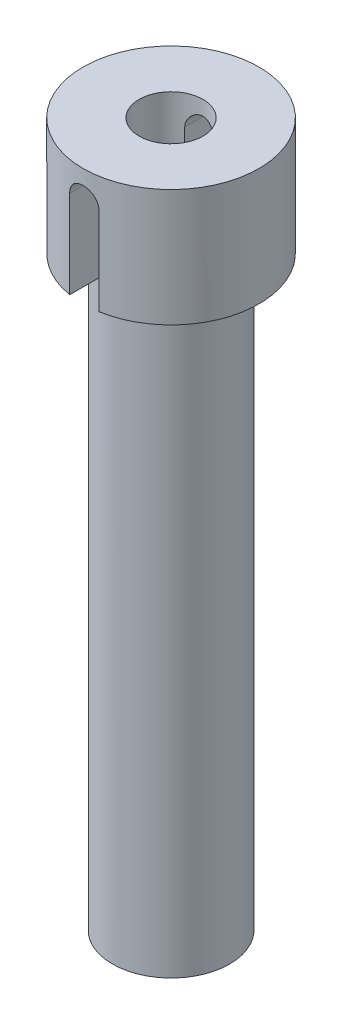
ISO-10303-21;
HEADER;
FILE_DESCRIPTION(('STEP AP214'),'2;1');
FILE_NAME('part.step','',(''),(''),'','','');
FILE_SCHEMA(('AUTOMOTIVE_DESIGN { 1 0 10303 214 1 1 1 1 }'));
ENDSEC;
DATA;
#1=APPLICATION_CONTEXT('core data for automotive mechanical design processes');
#2=APPLICATION_PROTOCOL_DEFINITION('international standard','automotive_design',2000,#1);
#3=PRODUCT_CONTEXT('',#1,'mechanical');
#4=PRODUCT('Part','Part','',(#3));
#5=PRODUCT_RELATED_PRODUCT_CATEGORY('part','',(#4));
#6=PRODUCT_DEFINITION_FORMATION('','',#4);
#7=PRODUCT_DEFINITION_CONTEXT('part definition',#1,'design');
#8=PRODUCT_DEFINITION('design','',#6,#7);
#9=PRODUCT_DEFINITION_SHAPE('','',#8);
#10=(LENGTH_UNIT() NAMED_UNIT(*) SI_UNIT(.MILLI.,.METRE.));
#11=(NAMED_UNIT(*) PLANE_ANGLE_UNIT() SI_UNIT($,.RADIAN.));
#12=(NAMED_UNIT(*) SI_UNIT($,.STERADIAN.) SOLID_ANGLE_UNIT());
#13=UNCERTAINTY_MEASURE_WITH_UNIT(LENGTH_MEASURE(1.E-05),#10,'distance_accuracy_value','');
#14=(GEOMETRIC_REPRESENTATION_CONTEXT(3) GLOBAL_UNCERTAINTY_ASSIGNED_CONTEXT((#13)) GLOBAL_UNIT_ASSIGNED_CONTEXT((#10,
#11,#12)) REPRESENTATION_CONTEXT('',''));
#15=CARTESIAN_POINT('',(0.,0.,0.));
#16=DIRECTION('',(0.,0.,1.));
#17=DIRECTION('',(1.,0.,0.));
#18=AXIS2_PLACEMENT_3D('',#15,#16,#17);
#19=CARTESIAN_POINT('',(0.,31.75,0.));
#20=DIRECTION('',(0.,1.,0.));
#21=DIRECTION('',(0.,0.,1.));
#22=AXIS2_PLACEMENT_3D('',#19,#20,#21);
#23=PLANE('',#22);
#24=CARTESIAN_POINT('',(0.,31.75,0.));
#25=DIRECTION('',(0.,1.,0.));
#26=DIRECTION('',(0.,0.,1.));
#27=AXIS2_PLACEMENT_3D('',#24,#25,#26);
#28=CIRCLE('',#27,4.7625);
#29=CARTESIAN_POINT('',(0.793750000000003,31.75,4.69588832783532));
#30=VERTEX_POINT('',#29);
#31=CARTESIAN_POINT('',(0.793750000000003,31.75,-4.69588832783532));
#32=VERTEX_POINT('',#31);
#33=EDGE_CURVE('E272',#30,#32,#28,.T.);
#34=ORIENTED_EDGE('',*,*,#33,.F.);
#35=DIRECTION('',(0.,0.,1.));
#36=VECTOR('',#35,1.);
#37=CARTESIAN_POINT('',(0.793750000000003,31.75,-4.7625));
#38=LINE('',#37,#36);
#39=CARTESIAN_POINT('',(0.793750000000003,31.75,3.07418053105213));
#40=VERTEX_POINT('',#39);
#41=EDGE_CURVE('E150',#40,#30,#38,.T.);
#42=ORIENTED_EDGE('',*,*,#41,.F.);
#43=CARTESIAN_POINT('',(0.,31.75,0.));
#44=DIRECTION('',(0.,1.,0.));
#45=DIRECTION('',(0.,0.,1.));
#46=AXIS2_PLACEMENT_3D('',#43,#44,#45);
#47=CIRCLE('',#46,3.175);
#48=CARTESIAN_POINT('',(0.793750000000003,31.75,-3.07418053105214));
#49=VERTEX_POINT('',#48);
#50=EDGE_CURVE('E154',#40,#49,#47,.T.);
#51=ORIENTED_EDGE('',*,*,#50,.T.);
#52=EDGE_CURVE('E253',#32,#49,#38,.T.);
#53=ORIENTED_EDGE('',*,*,#52,.F.);
#54=EDGE_LOOP('',(#34,#42,#51,#53));
#55=FACE_BOUND('',#54,.T.);
#56=ADVANCED_FACE('F38',(#55),#23,.F.);
#57=CARTESIAN_POINT('',(0.,31.75,0.));
#58=DIRECTION('',(0.,-1.,0.));
#59=DIRECTION('',(0.,0.,-1.));
#60=AXIS2_PLACEMENT_3D('',#57,#58,#59);
#61=CYLINDRICAL_SURFACE('',#60,3.175);
#62=ORIENTED_EDGE('',*,*,#50,.F.);
#63=CARTESIAN_POINT('',(0.79375,31.75,3.07418053105214));
#64=CARTESIAN_POINT('',(0.793791126432167,31.7060875081703,3.07414310689664));
#65=CARTESIAN_POINT('',(0.790108787395913,31.6622025119373,3.07512046232531));
#66=CARTESIAN_POINT('',(0.775620219149862,31.5757879290246,3.07882075469563));
#67=CARTESIAN_POINT('',(0.764828474578016,31.5332557703956,3.08154014212687));
#68=CARTESIAN_POINT('',(0.736443106169091,31.4506629474007,3.08844232490262));
#69=CARTESIAN_POINT('',(0.718850121521114,31.4106020511926,3.09262498272364));
#70=CARTESIAN_POINT('',(0.677397548848632,31.333985020205,3.1019688250919));
#71=CARTESIAN_POINT('',(0.653536280428175,31.2974298288243,3.1071302719287));
#72=CARTESIAN_POINT('',(0.599666049706842,31.2280749621041,3.11797889110675));
#73=CARTESIAN_POINT('',(0.569545274172009,31.1953634212033,3.12367441490487));
#74=CARTESIAN_POINT('',(0.504250083699317,31.1353976042945,3.13487681754014));
#75=CARTESIAN_POINT('',(0.469074862496363,31.1081442006102,3.14038366610668));
#76=CARTESIAN_POINT('',(0.394062682242309,31.0595081731366,3.15068093282098));
#77=CARTESIAN_POINT('',(0.354167556301449,31.0382127157747,3.15546028964886));
#78=CARTESIAN_POINT('',(0.271226426571567,31.002664734021,3.16366800212568));
#79=CARTESIAN_POINT('',(0.22818104481283,30.9884108235331,3.16709662363373));
#80=CARTESIAN_POINT('',(0.14108438741852,30.9676331766177,3.17215758031262));
#81=CARTESIAN_POINT('',(0.0970711184315754,30.9609587855859,3.17382487589221));
#82=CARTESIAN_POINT('',(0.00851914035556472,30.955056698266,3.17529716558393));
#83=CARTESIAN_POINT('',(-0.0360195019884107,30.9558280660083,3.17510239376739));
#84=CARTESIAN_POINT('',(-0.123311041207992,30.9646875338235,3.17289844652264));
#85=CARTESIAN_POINT('',(-0.166081631982261,30.9726128519656,3.17092963948335));
#86=CARTESIAN_POINT('',(-0.24966510194695,30.9952935140616,3.16544587444538));
#87=CARTESIAN_POINT('',(-0.290477894430435,31.0100491602094,3.16193084803775));
#88=CARTESIAN_POINT('',(-0.369417033275531,31.0461035165431,3.15368779472933));
#89=CARTESIAN_POINT('',(-0.407515718495056,31.0674602441752,3.1489490760049));
#90=CARTESIAN_POINT('',(-0.479644576040554,31.1160661093024,3.13877281774031));
#91=CARTESIAN_POINT('',(-0.513674134228037,31.1433161345127,3.13333517297012));
#92=CARTESIAN_POINT('',(-0.577666953080635,31.2038038864653,3.12218043030613));
#93=CARTESIAN_POINT('',(-0.607495850549086,31.2371832365037,3.11645975066653));
#94=CARTESIAN_POINT('',(-0.661169600304205,31.3085399568737,3.1055164607544));
#95=CARTESIAN_POINT('',(-0.685012814507052,31.3465185816688,3.10029398706629));
#96=CARTESIAN_POINT('',(-0.726126237995697,31.4262655682727,3.09092452034143));
#97=CARTESIAN_POINT('',(-0.743360382948011,31.4680532252613,3.08678346644752));
#98=CARTESIAN_POINT('',(-0.77049499178081,31.554036561932,3.08012352928101));
#99=CARTESIAN_POINT('',(-0.780406418937131,31.5982285350252,3.0776022217314));
#100=CARTESIAN_POINT('',(-0.788911804151056,31.6606692959774,3.0754263697846));
#101=CARTESIAN_POINT('',(-0.790726440329824,31.6784987644255,3.07495990219245));
#102=CARTESIAN_POINT('',(-0.793144176422306,31.7142159957405,3.07433712100624));
#103=CARTESIAN_POINT('',(-0.793749236488736,31.7321036171645,3.07418030561697));
#104=CARTESIAN_POINT('',(-0.79375,31.75,3.07418053105214));
#105=B_SPLINE_CURVE_WITH_KNOTS('',3,(#63,#64,#65,#66,#67,#68,#69,#70,#71,#72,#73,#74,#75,#76,
#77,#78,#79,#80,#81,#82,#83,#84,#85,#86,#87,#88,#89,#90,#91,#92,#93,#94,#95,#96,#97,#98,#99,
#100,#101,#102,#103,#104),.UNSPECIFIED.,.F.,.F.,(4,2,2,2,2,2,2,2,2,2,2,2,2,2,2,2,2,2,2,2,4),(0.,
0.131530270967041,0.262793388707346,0.394044173172473,0.525330179201699,0.659201611595798,
0.79309442238408,0.928854340604584,1.06458752445096,1.19757280254024,1.33054136392442,
1.4605585602541,1.59058150947681,1.72178139927471,1.8530010656667,1.98775845244277,
2.12255267776127,2.25807232179081,2.39338865786098,2.44713665474836,2.50079748063248),.UNSPECIFIED.);
#106=CARTESIAN_POINT('',(-0.79375,31.75,3.07418053105213));
#107=VERTEX_POINT('',#106);
#108=EDGE_CURVE('E134',#40,#107,#105,.T.);
#109=ORIENTED_EDGE('',*,*,#108,.T.);
#110=CARTESIAN_POINT('',(-0.79375,31.75,-3.07418053105214));
#111=VERTEX_POINT('',#110);
#112=EDGE_CURVE('E147',#111,#107,#47,.T.);
#113=ORIENTED_EDGE('',*,*,#112,.F.);
#114=CARTESIAN_POINT('',(-0.79375,31.75,-3.07418053105214));
#115=CARTESIAN_POINT('',(-0.793791126432167,31.7060875081703,-3.07414310689664));
#116=CARTESIAN_POINT('',(-0.790108787395913,31.6622025119373,-3.07512046232531));
#117=CARTESIAN_POINT('',(-0.775620219149862,31.5757879290246,-3.07882075469563));
#118=CARTESIAN_POINT('',(-0.764828474578016,31.5332557703956,-3.08154014212687));
#119=CARTESIAN_POINT('',(-0.736443106169091,31.4506629474007,-3.08844232490262));
#120=CARTESIAN_POINT('',(-0.718850121521114,31.4106020511926,-3.09262498272364));
#121=CARTESIAN_POINT('',(-0.677397548848632,31.333985020205,-3.1019688250919));
#122=CARTESIAN_POINT('',(-0.653536280428175,31.2974298288243,-3.1071302719287));
#123=CARTESIAN_POINT('',(-0.599666049706842,31.2280749621041,-3.11797889110675));
#124=CARTESIAN_POINT('',(-0.569545274172009,31.1953634212033,-3.12367441490487));
#125=CARTESIAN_POINT('',(-0.504250083699317,31.1353976042945,-3.13487681754014));
#126=CARTESIAN_POINT('',(-0.469074862496363,31.1081442006102,-3.14038366610668));
#127=CARTESIAN_POINT('',(-0.394062682242309,31.0595081731366,-3.15068093282098));
#128=CARTESIAN_POINT('',(-0.354167556301449,31.0382127157747,-3.15546028964886));
#129=CARTESIAN_POINT('',(-0.271226426571567,31.002664734021,-3.16366800212568));
#130=CARTESIAN_POINT('',(-0.22818104481283,30.9884108235331,-3.16709662363373));
#131=CARTESIAN_POINT('',(-0.14108438741852,30.9676331766177,-3.17215758031262));
#132=CARTESIAN_POINT('',(-0.0970711184315752,30.9609587855859,-3.17382487589221));
#133=CARTESIAN_POINT('',(-0.00851914035556457,30.955056698266,-3.17529716558393));
#134=CARTESIAN_POINT('',(0.0360195019884109,30.9558280660083,-3.17510239376739));
#135=CARTESIAN_POINT('',(0.123311041207992,30.9646875338235,-3.17289844652264));
#136=CARTESIAN_POINT('',(0.166081631982261,30.9726128519656,-3.17092963948335));
#137=CARTESIAN_POINT('',(0.24966510194695,30.9952935140616,-3.16544587444538));
#138=CARTESIAN_POINT('',(0.290477894430435,31.0100491602094,-3.16193084803775));
#139=CARTESIAN_POINT('',(0.369417033275531,31.0461035165431,-3.15368779472933));
#140=CARTESIAN_POINT('',(0.407515718495056,31.0674602441752,-3.1489490760049));
#141=CARTESIAN_POINT('',(0.479644576040554,31.1160661093024,-3.13877281774031));
#142=CARTESIAN_POINT('',(0.513674134228037,31.1433161345127,-3.13333517297012));
#143=CARTESIAN_POINT('',(0.577666953080634,31.2038038864653,-3.12218043030613));
#144=CARTESIAN_POINT('',(0.607495850549086,31.2371832365037,-3.11645975066653));
#145=CARTESIAN_POINT('',(0.661169600304205,31.3085399568737,-3.1055164607544));
#146=CARTESIAN_POINT('',(0.685012814507052,31.3465185816688,-3.10029398706629));
#147=CARTESIAN_POINT('',(0.726126237995697,31.4262655682727,-3.09092452034143));
#148=CARTESIAN_POINT('',(0.743360382948011,31.4680532252613,-3.08678346644752));
#149=CARTESIAN_POINT('',(0.77049499178081,31.554036561932,-3.08012352928101));
#150=CARTESIAN_POINT('',(0.780406418937131,31.5982285350252,-3.0776022217314));
#151=CARTESIAN_POINT('',(0.788911804151056,31.6606692959774,-3.0754263697846));
#152=CARTESIAN_POINT('',(0.790726440329824,31.6784987644255,-3.07495990219245));
#153=CARTESIAN_POINT('',(0.793144176422306,31.7142159957405,-3.07433712100624));
#154=CARTESIAN_POINT('',(0.793749236488736,31.7321036171645,-3.07418030561697));
#155=CARTESIAN_POINT('',(0.79375,31.75,-3.07418053105214));
#156=B_SPLINE_CURVE_WITH_KNOTS('',3,(#114,#115,#116,#117,#118,#119,#120,#121,#122,#123,#124,
#125,#126,#127,#128,#129,#130,#131,#132,#133,#134,#135,#136,#137,#138,#139,#140,#141,#142,#143,
#144,#145,#146,#147,#148,#149,#150,#151,#152,#153,#154,#155),.UNSPECIFIED.,.F.,.F.,(4,2,2,2,2,2,
2,2,2,2,2,2,2,2,2,2,2,2,2,2,4),(0.,0.131530270967041,0.262793388707346,0.394044173172473,
0.525330179201699,0.659201611595799,0.79309442238408,0.928854340604584,1.06458752445096,
1.19757280254024,1.33054136392442,1.4605585602541,1.59058150947681,1.72178139927471,
1.8530010656667,1.98775845244277,2.12255267776127,2.25807232179082,2.39338865786098,
2.44713665474836,2.50079748063248),.UNSPECIFIED.);
#157=EDGE_CURVE('E123',#111,#49,#156,.T.);
#158=ORIENTED_EDGE('',*,*,#157,.T.);
#159=EDGE_LOOP('',(#62,#109,#113,#158));
#160=FACE_BOUND('',#159,.T.);
#161=CARTESIAN_POINT('',(0.,0.,0.));
#162=DIRECTION('',(0.,1.,0.));
#163=DIRECTION('',(0.,0.,1.));
#164=AXIS2_PLACEMENT_3D('',#161,#162,#163);
#165=CIRCLE('',#164,3.175);
#166=CARTESIAN_POINT('',(0.,0.,3.175));
#167=VERTEX_POINT('',#166);
#168=EDGE_CURVE('E155',#167,#167,#165,.T.);
#169=ORIENTED_EDGE('',*,*,#168,.T.);
#170=EDGE_LOOP('',(#169));
#171=FACE_BOUND('',#170,.T.);
#172=ADVANCED_FACE('F40',(#160,#171),#61,.T.);
#173=CARTESIAN_POINT('',(0.,0.,0.));
#174=DIRECTION('',(0.,1.,0.));
#175=DIRECTION('',(0.,0.,1.));
#176=AXIS2_PLACEMENT_3D('',#173,#174,#175);
#177=PLANE('',#176);
#178=CARTESIAN_POINT('',(0.,0.,0.));
#179=DIRECTION('',(0.,1.,0.));
#180=DIRECTION('',(0.,0.,1.));
#181=AXIS2_PLACEMENT_3D('',#178,#179,#180);
#182=CIRCLE('',#181,1.72719999999999);
#183=CARTESIAN_POINT('',(0.,0.,1.72719999999999));
#184=VERTEX_POINT('',#183);
#185=EDGE_CURVE('E274',#184,#184,#182,.T.);
#186=ORIENTED_EDGE('',*,*,#185,.T.);
#187=EDGE_LOOP('',(#186));
#188=FACE_BOUND('',#187,.T.);
#189=ORIENTED_EDGE('',*,*,#168,.F.);
#190=EDGE_LOOP('',(#189));
#191=FACE_BOUND('',#190,.T.);
#192=ADVANCED_FACE('F293',(#188,#191),#177,.F.);
#193=CARTESIAN_POINT('',(-0.793750000000001,31.75,-4.69588832783532));
#194=VERTEX_POINT('',#193);
#195=CARTESIAN_POINT('',(-0.79375,31.75,4.69588832783532));
#196=VERTEX_POINT('',#195);
#197=EDGE_CURVE('E149',#194,#196,#28,.T.);
#198=ORIENTED_EDGE('',*,*,#197,.F.);
#199=DIRECTION('',(0.,0.,1.));
#200=VECTOR('',#199,1.);
#201=CARTESIAN_POINT('',(-0.79375,31.75,-4.7625));
#202=LINE('',#201,#200);
#203=EDGE_CURVE('E67',#194,#111,#202,.T.);
#204=ORIENTED_EDGE('',*,*,#203,.T.);
#205=ORIENTED_EDGE('',*,*,#112,.T.);
#206=EDGE_CURVE('E151',#107,#196,#202,.T.);
#207=ORIENTED_EDGE('',*,*,#206,.T.);
#208=EDGE_LOOP('',(#198,#204,#205,#207));
#209=FACE_BOUND('',#208,.T.);
#210=ADVANCED_FACE('F145',(#209),#23,.F.);
#211=CARTESIAN_POINT('',(0.,38.1,0.));
#212=DIRECTION('',(0.,-1.,0.));
#213=DIRECTION('',(0.,0.,-1.));
#214=AXIS2_PLACEMENT_3D('',#211,#212,#213);
#215=CYLINDRICAL_SURFACE('',#214,4.7625);
#216=CARTESIAN_POINT('',(0.,38.1,0.));
#217=DIRECTION('',(0.,1.,0.));
#218=DIRECTION('',(0.,0.,1.));
#219=AXIS2_PLACEMENT_3D('',#216,#217,#218);
#220=CIRCLE('',#219,4.7625);
#221=CARTESIAN_POINT('',(0.,38.1,4.7625));
#222=VERTEX_POINT('',#221);
#223=EDGE_CURVE('E158',#222,#222,#220,.T.);
#224=ORIENTED_EDGE('',*,*,#223,.F.);
#225=EDGE_LOOP('',(#224));
#226=FACE_BOUND('',#225,.T.);
#227=DIRECTION('',(0.,-1.,0.));
#228=VECTOR('',#227,1.);
#229=CARTESIAN_POINT('',(0.793749999999998,38.1,-4.69588832783532));
#230=LINE('',#229,#228);
#231=CARTESIAN_POINT('',(0.79375,36.5125,-4.69588832783532));
#232=VERTEX_POINT('',#231);
#233=EDGE_CURVE('E202',#32,#232,#230,.F.);
#234=ORIENTED_EDGE('',*,*,#233,.T.);
#235=CARTESIAN_POINT('',(0.79375,36.5125,-4.69588832783532));
#236=CARTESIAN_POINT('',(0.793789378101121,36.556826037943,-4.69586379445431));
#237=CARTESIAN_POINT('',(0.790039520432826,36.6011336790469,-4.69651527828899));
#238=CARTESIAN_POINT('',(0.775260388672243,36.6884272643288,-4.69898689448322));
#239=CARTESIAN_POINT('',(0.764240668633823,36.7314148658091,-4.7008054929354));
#240=CARTESIAN_POINT('',(0.735216253025076,36.8149153484446,-4.70542935071898));
#241=CARTESIAN_POINT('',(0.717210023184568,36.8554276837562,-4.70823482676067));
#242=CARTESIAN_POINT('',(0.674748996518666,36.9328588531935,-4.71450761492235));
#243=CARTESIAN_POINT('',(0.650294115788974,36.9697776405545,-4.71797493565354));
#244=CARTESIAN_POINT('',(0.595373550894959,37.0393303140357,-4.72522034281928));
#245=CARTESIAN_POINT('',(0.564857357203615,37.0719240684342,-4.72900087345656));
#246=CARTESIAN_POINT('',(0.498786903668918,37.131556791129,-4.73642494294252));
#247=CARTESIAN_POINT('',(0.463231872889268,37.1585949078655,-4.74006846072026));
#248=CARTESIAN_POINT('',(0.387832446884617,37.2064968207141,-4.74683380221988));
#249=CARTESIAN_POINT('',(0.34796378420732,37.2273229148897,-4.74995239221908));
#250=CARTESIAN_POINT('',(0.265235661562713,37.2619662265721,-4.75528886936153));
#251=CARTESIAN_POINT('',(0.222376566694255,37.2757842979841,-4.75750686623259));
#252=CARTESIAN_POINT('',(0.135301151183474,37.2958970109311,-4.76077511259901));
#253=CARTESIAN_POINT('',(0.0911009746503003,37.3022598001853,-4.76183593340943));
#254=CARTESIAN_POINT('',(0.00224746549831503,37.3074932779765,-4.7627066313961));
#255=CARTESIAN_POINT('',(-0.0424058469799614,37.3063642980565,-4.76251656392952));
#256=CARTESIAN_POINT('',(-0.130429834438074,37.2966991564408,-4.76091522294728));
#257=CARTESIAN_POINT('',(-0.17380883630316,37.2882365344299,-4.75951607414722));
#258=CARTESIAN_POINT('',(-0.258522092796689,37.2642601816887,-4.75566731704393));
#259=CARTESIAN_POINT('',(-0.299856298160218,37.2487462811649,-4.7532176834453));
#260=CARTESIAN_POINT('',(-0.379526319465393,37.2110343819102,-4.74752251447483));
#261=CARTESIAN_POINT('',(-0.417847467282033,37.1888059628555,-4.74427336958264));
#262=CARTESIAN_POINT('',(-0.490242081389746,37.138319077843,-4.73734033130495));
#263=CARTESIAN_POINT('',(-0.524315361707614,37.1100603480227,-4.7336564188989));
#264=CARTESIAN_POINT('',(-0.587678975066217,37.0479114636045,-4.72621111659405));
#265=CARTESIAN_POINT('',(-0.616906941930364,37.0139577443459,-4.72244932757467));
#266=CARTESIAN_POINT('',(-0.669269207196587,36.9415835837212,-4.71531396225441));
#267=CARTESIAN_POINT('',(-0.692401768215521,36.9031618733248,-4.71194049679197));
#268=CARTESIAN_POINT('',(-0.731928989426751,36.8228646260976,-4.70596303316436));
#269=CARTESIAN_POINT('',(-0.748312200087149,36.7809833637868,-4.70336034462266));
#270=CARTESIAN_POINT('',(-0.773770309296436,36.6950389199281,-4.69923982017744));
#271=CARTESIAN_POINT('',(-0.782856134440365,36.6509791058062,-4.69772036270425));
#272=CARTESIAN_POINT('',(-0.790025680696496,36.5909035145426,-4.69651652199119));
#273=CARTESIAN_POINT('',(-0.791422883116209,36.5752424512317,-4.69628115967762));
#274=CARTESIAN_POINT('',(-0.793283827342451,36.5438898753368,-4.69596722105045));
#275=CARTESIAN_POINT('',(-0.793749138987004,36.5281984586079,-4.69588838106552));
#276=CARTESIAN_POINT('',(-0.793750000000001,36.5125,-4.69588832783533));
#277=B_SPLINE_CURVE_WITH_KNOTS('',3,(#235,#236,#237,#238,#239,#240,#241,#242,#243,#244,#245,
#246,#247,#248,#249,#250,#251,#252,#253,#254,#255,#256,#257,#258,#259,#260,#261,#262,#263,#264,
#265,#266,#267,#268,#269,#270,#271,#272,#273,#274,#275,#276),.UNSPECIFIED.,.F.,.F.,(4,2,2,2,2,2,
2,2,2,2,2,2,2,2,2,2,2,2,2,2,4),(0.,0.132787398390374,0.265400634278613,0.398043009150665,
0.530687109936322,0.664486794421511,0.798306972249968,0.932923534883666,1.06752369097829,
1.20088364197594,1.33423769126144,1.46626977762679,1.59830504346964,1.73094770677991,
1.8635961751971,1.99783794700485,2.13211794066765,2.26662479680671,2.40092987433434,
2.44808360261026,2.49515782994848),.UNSPECIFIED.);
#278=CARTESIAN_POINT('',(-0.79375,36.5125,-4.69588832783532));
#279=VERTEX_POINT('',#278);
#280=EDGE_CURVE('E208',#232,#279,#277,.T.);
#281=ORIENTED_EDGE('',*,*,#280,.T.);
#282=DIRECTION('',(0.,-1.,0.));
#283=VECTOR('',#282,1.);
#284=CARTESIAN_POINT('',(-0.793750000000001,38.1,-4.69588832783532));
#285=LINE('',#284,#283);
#286=EDGE_CURVE('E135',#279,#194,#285,.T.);
#287=ORIENTED_EDGE('',*,*,#286,.T.);
#288=ORIENTED_EDGE('',*,*,#197,.T.);
#289=DIRECTION('',(0.,-1.,0.));
#290=VECTOR('',#289,1.);
#291=CARTESIAN_POINT('',(-0.793750000000001,38.1,4.69588832783532));
#292=LINE('',#291,#290);
#293=CARTESIAN_POINT('',(-0.793750000000001,36.5125,4.69588832783532));
#294=VERTEX_POINT('',#293);
#295=EDGE_CURVE('E257',#196,#294,#292,.F.);
#296=ORIENTED_EDGE('',*,*,#295,.T.);
#297=CARTESIAN_POINT('',(-0.79375,36.5125,4.69588832783532));
#298=CARTESIAN_POINT('',(-0.793789378101121,36.556826037943,4.69586379445431));
#299=CARTESIAN_POINT('',(-0.790039520432826,36.6011336790469,4.69651527828899));
#300=CARTESIAN_POINT('',(-0.775260388672243,36.6884272643288,4.69898689448322));
#301=CARTESIAN_POINT('',(-0.764240668633824,36.7314148658091,4.7008054929354));
#302=CARTESIAN_POINT('',(-0.735216253025076,36.8149153484446,4.70542935071898));
#303=CARTESIAN_POINT('',(-0.71721002318457,36.8554276837562,4.70823482676067));
#304=CARTESIAN_POINT('',(-0.674748996518668,36.9328588531935,4.71450761492235));
#305=CARTESIAN_POINT('',(-0.650294115788975,36.9697776405545,4.71797493565354));
#306=CARTESIAN_POINT('',(-0.595373550894959,37.0393303140357,4.72522034281928));
#307=CARTESIAN_POINT('',(-0.564857357203615,37.0719240684342,4.72900087345656));
#308=CARTESIAN_POINT('',(-0.498786903668918,37.131556791129,4.73642494294252));
#309=CARTESIAN_POINT('',(-0.463231872889268,37.1585949078655,4.74006846072026));
#310=CARTESIAN_POINT('',(-0.387832446884617,37.2064968207141,4.74683380221988));
#311=CARTESIAN_POINT('',(-0.34796378420732,37.2273229148897,4.74995239221908));
#312=CARTESIAN_POINT('',(-0.265235661562713,37.2619662265721,4.75528886936153));
#313=CARTESIAN_POINT('',(-0.222376566694255,37.2757842979841,4.75750686623259));
#314=CARTESIAN_POINT('',(-0.135301151183475,37.2958970109311,4.76077511259901));
#315=CARTESIAN_POINT('',(-0.0911009746503005,37.3022598001853,4.76183593340943));
#316=CARTESIAN_POINT('',(-0.00224746549831515,37.3074932779765,4.7627066313961));
#317=CARTESIAN_POINT('',(0.0424058469799613,37.3063642980565,4.76251656392952));
#318=CARTESIAN_POINT('',(0.130429834438074,37.2966991564408,4.76091522294728));
#319=CARTESIAN_POINT('',(0.17380883630316,37.2882365344299,4.75951607414722));
#320=CARTESIAN_POINT('',(0.258522092796689,37.2642601816887,4.75566731704393));
#321=CARTESIAN_POINT('',(0.299856298160218,37.2487462811649,4.7532176834453));
#322=CARTESIAN_POINT('',(0.379526319465393,37.2110343819102,4.74752251447483));
#323=CARTESIAN_POINT('',(0.417847467282033,37.1888059628555,4.74427336958264));
#324=CARTESIAN_POINT('',(0.490242081389746,37.138319077843,4.73734033130495));
#325=CARTESIAN_POINT('',(0.524315361707615,37.1100603480227,4.7336564188989));
#326=CARTESIAN_POINT('',(0.587678975066217,37.0479114636045,4.72621111659405));
#327=CARTESIAN_POINT('',(0.616906941930364,37.0139577443459,4.72244932757467));
#328=CARTESIAN_POINT('',(0.669269207196587,36.9415835837212,4.71531396225441));
#329=CARTESIAN_POINT('',(0.692401768215521,36.9031618733248,4.71194049679197));
#330=CARTESIAN_POINT('',(0.731928989426751,36.8228646260976,4.70596303316436));
#331=CARTESIAN_POINT('',(0.748312200087149,36.7809833637868,4.70336034462266));
#332=CARTESIAN_POINT('',(0.773770309296436,36.6950389199281,4.69923982017744));
#333=CARTESIAN_POINT('',(0.782856134440365,36.6509791058062,4.69772036270425));
#334=CARTESIAN_POINT('',(0.790025680696496,36.5909035145426,4.69651652199119));
#335=CARTESIAN_POINT('',(0.791422883116209,36.5752424512317,4.69628115967762));
#336=CARTESIAN_POINT('',(0.793283827342451,36.5438898753368,4.69596722105045));
#337=CARTESIAN_POINT('',(0.793749138987004,36.5281984586079,4.69588838106552));
#338=CARTESIAN_POINT('',(0.793750000000001,36.5125,4.69588832783533));
#339=B_SPLINE_CURVE_WITH_KNOTS('',3,(#297,#298,#299,#300,#301,#302,#303,#304,#305,#306,#307,
#308,#309,#310,#311,#312,#313,#314,#315,#316,#317,#318,#319,#320,#321,#322,#323,#324,#325,#326,
#327,#328,#329,#330,#331,#332,#333,#334,#335,#336,#337,#338),.UNSPECIFIED.,.F.,.F.,(4,2,2,2,2,2,
2,2,2,2,2,2,2,2,2,2,2,2,2,2,4),(0.,0.132787398390374,0.265400634278613,0.398043009150658,
0.530687109936322,0.664486794421511,0.798306972249968,0.932923534883666,1.06752369097829,
1.20088364197594,1.33423769126144,1.46626977762679,1.59830504346964,1.73094770677991,
1.8635961751971,1.99783794700485,2.13211794066764,2.26662479680671,2.40092987433434,
2.44808360261026,2.49515782994848),.UNSPECIFIED.);
#340=CARTESIAN_POINT('',(0.79375,36.5125,4.69588832783532));
#341=VERTEX_POINT('',#340);
#342=EDGE_CURVE('E214',#294,#341,#339,.T.);
#343=ORIENTED_EDGE('',*,*,#342,.T.);
#344=DIRECTION('',(0.,-1.,0.));
#345=VECTOR('',#344,1.);
#346=CARTESIAN_POINT('',(0.793749999999998,38.1,4.69588832783532));
#347=LINE('',#346,#345);
#348=EDGE_CURVE('E205',#341,#30,#347,.T.);
#349=ORIENTED_EDGE('',*,*,#348,.T.);
#350=ORIENTED_EDGE('',*,*,#33,.T.);
#351=EDGE_LOOP('',(#234,#281,#287,#288,#296,#343,#349,#350));
#352=FACE_BOUND('',#351,.T.);
#353=ADVANCED_FACE('F219',(#226,#352),#215,.T.);
#354=CARTESIAN_POINT('',(0.,38.1,0.));
#355=DIRECTION('',(0.,1.,0.));
#356=DIRECTION('',(0.,0.,1.));
#357=AXIS2_PLACEMENT_3D('',#354,#355,#356);
#358=PLANE('',#357);
#359=CARTESIAN_POINT('',(0.,38.1,0.));
#360=DIRECTION('',(0.,1.,0.));
#361=DIRECTION('',(0.,0.,1.));
#362=AXIS2_PLACEMENT_3D('',#359,#360,#361);
#363=CIRCLE('',#362,1.72719999999999);
#364=CARTESIAN_POINT('',(0.,38.1,1.72719999999999));
#365=VERTEX_POINT('',#364);
#366=EDGE_CURVE('E276',#365,#365,#363,.T.);
#367=ORIENTED_EDGE('',*,*,#366,.F.);
#368=EDGE_LOOP('',(#367));
#369=FACE_BOUND('',#368,.T.);
#370=ORIENTED_EDGE('',*,*,#223,.T.);
#371=EDGE_LOOP('',(#370));
#372=FACE_BOUND('',#371,.T.);
#373=ADVANCED_FACE('F284',(#369,#372),#358,.T.);
#374=CARTESIAN_POINT('',(0.,38.1,0.));
#375=DIRECTION('',(0.,1.,0.));
#376=DIRECTION('',(0.,0.,1.));
#377=AXIS2_PLACEMENT_3D('',#374,#375,#376);
#378=CYLINDRICAL_SURFACE('',#377,1.72719999999999);
#379=DIRECTION('',(0.,1.,0.));
#380=VECTOR('',#379,1.);
#381=CARTESIAN_POINT('',(0.793749999999998,38.1,1.53400807608695));
#382=LINE('',#381,#380);
#383=CARTESIAN_POINT('',(0.793750000000003,31.75,1.53400807608694));
#384=VERTEX_POINT('',#383);
#385=CARTESIAN_POINT('',(0.79375,36.5125,1.53400807608694));
#386=VERTEX_POINT('',#385);
#387=EDGE_CURVE('E52',#384,#386,#382,.T.);
#388=ORIENTED_EDGE('',*,*,#387,.T.);
#389=CARTESIAN_POINT('',(0.79375,36.5125,1.53400807608694));
#390=CARTESIAN_POINT('',(0.793751275656469,36.5335394366391,1.53400454042616));
#391=CARTESIAN_POINT('',(0.792912938837507,36.554567315188,1.53444145999201));
#392=CARTESIAN_POINT('',(0.789577801219466,36.5964458104127,1.53616148082301));
#393=CARTESIAN_POINT('',(0.787081843528467,36.6172965117477,1.53744415191506));
#394=CARTESIAN_POINT('',(0.777175896861143,36.6791433977735,1.5424898133022));
#395=CARTESIAN_POINT('',(0.767347266160624,36.7196821687943,1.54745126684986));
#396=CARTESIAN_POINT('',(0.741676035775504,36.7982731178537,1.55991547136942));
#397=CARTESIAN_POINT('',(0.725842981319754,36.8363291307731,1.56741418682886));
#398=CARTESIAN_POINT('',(0.688672526049634,36.9092970776987,1.58409739296676));
#399=CARTESIAN_POINT('',(0.667328003830584,36.9442048645323,1.5932840601964));
#400=CARTESIAN_POINT('',(0.61803268672526,37.012466729779,1.61307370999576));
#401=CARTESIAN_POINT('',(0.58972959638895,37.0455507214083,1.62373060057895));
#402=CARTESIAN_POINT('',(0.528060727059651,37.1067030402723,1.64482017277706));
#403=CARTESIAN_POINT('',(0.49469373149311,37.1347701586945,1.65525279982454));
#404=CARTESIAN_POINT('',(0.421596465384426,37.1865994255987,1.67540711765938));
#405=CARTESIAN_POINT('',(0.38161742468797,37.2100406508386,1.6850583375683));
#406=CARTESIAN_POINT('',(0.297757869142571,37.2497434665232,1.70187664493476));
#407=CARTESIAN_POINT('',(0.253879457185036,37.2660088989084,1.70904506124966));
#408=CARTESIAN_POINT('',(0.166337649903327,37.289867380336,1.71970176727884));
#409=CARTESIAN_POINT('',(0.122828070549754,37.2979336488211,1.72338985412364));
#410=CARTESIAN_POINT('',(0.034927043960315,37.3067085815988,1.72740609569215));
#411=CARTESIAN_POINT('',(-0.00946396666181533,37.3074208018789,1.72773587429621));
#412=CARTESIAN_POINT('',(-0.0943698547927264,37.3016830712387,1.72510468336714));
#413=CARTESIAN_POINT('',(-0.134929167674622,37.2957574142658,1.72238459335843));
#414=CARTESIAN_POINT('',(-0.214401489040043,37.2778304399893,1.71430675915793));
#415=CARTESIAN_POINT('',(-0.253314406371142,37.2658287867648,1.70894886913173));
#416=CARTESIAN_POINT('',(-0.329108062096195,37.23597205187,1.6959980913551));
#417=CARTESIAN_POINT('',(-0.365949389143355,37.2180315719098,1.68837277193251));
#418=CARTESIAN_POINT('',(-0.43619500536756,37.1769029599206,1.67160397385226));
#419=CARTESIAN_POINT('',(-0.469597973688887,37.1537128220833,1.6624599152658));
#420=CARTESIAN_POINT('',(-0.53496779354023,37.1005207308996,1.64264740194782));
#421=CARTESIAN_POINT('',(-0.566585889399607,37.0701133894957,1.63191541632935));
#422=CARTESIAN_POINT('',(-0.624448309087947,37.0044549931421,1.61066332776191));
#423=CARTESIAN_POINT('',(-0.65068897669369,36.9692006696651,1.60014337333044));
#424=CARTESIAN_POINT('',(-0.698246477382904,36.8927782763336,1.57999090934957));
#425=CARTESIAN_POINT('',(-0.719269382368154,36.8514085560463,1.57042450294329));
#426=CARTESIAN_POINT('',(-0.753878510381868,36.7651922985746,1.55410980260937));
#427=CARTESIAN_POINT('',(-0.767480240136925,36.7203532364058,1.54735563948469));
#428=CARTESIAN_POINT('',(-0.782573571307504,36.6479773194578,1.53975201729347));
#429=CARTESIAN_POINT('',(-0.786752978222178,36.6211106309574,1.53761371799712));
#430=CARTESIAN_POINT('',(-0.792344887630314,36.5670033852394,1.53473542933206));
#431=CARTESIAN_POINT('',(-0.793755899167416,36.5397626345134,1.53399619345524));
#432=CARTESIAN_POINT('',(-0.79375,36.5125,1.53400807608694));
#433=B_SPLINE_CURVE_WITH_KNOTS('',3,(#389,#390,#391,#392,#393,#394,#395,#396,#397,#398,#399,
#400,#401,#402,#403,#404,#405,#406,#407,#408,#409,#410,#411,#412,#413,#414,#415,#416,#417,#418,
#419,#420,#421,#422,#423,#424,#425,#426,#427,#428,#429,#430,#431,#432),.UNSPECIFIED.,.F.,.F.,(4,
2,2,2,2,2,2,2,2,2,2,2,2,2,2,2,2,2,2,2,2,4),(0.,0.0630749269123049,0.126117796859524,
0.251470560098082,0.37662487982439,0.501941728633059,0.635840045800712,0.769770582326647,
0.911053648149976,1.05226097853298,1.18475467041602,1.31718429309799,1.43984802615934,
1.56251854161561,1.68703575303615,1.81160062098703,1.94649446484477,2.08147972368148,
2.22289207256749,2.36400779410721,2.44566501552216,2.52736620246729),.UNSPECIFIED.);
#434=CARTESIAN_POINT('',(-0.79375,36.5125,1.53400807608694));
#435=VERTEX_POINT('',#434);
#436=EDGE_CURVE('E11',#386,#435,#433,.T.);
#437=ORIENTED_EDGE('',*,*,#436,.T.);
#438=DIRECTION('',(0.,1.,0.));
#439=VECTOR('',#438,1.);
#440=CARTESIAN_POINT('',(-0.793750000000001,38.1,1.53400807608694));
#441=LINE('',#440,#439);
#442=CARTESIAN_POINT('',(-0.793750000000001,31.75,1.53400807608694));
#443=VERTEX_POINT('',#442);
#444=EDGE_CURVE('E235',#435,#443,#441,.F.);
#445=ORIENTED_EDGE('',*,*,#444,.T.);
#446=CARTESIAN_POINT('',(-0.79375,31.75,1.53400807608694));
#447=CARTESIAN_POINT('',(-0.793751275656469,31.7289605633609,1.53400454042616));
#448=CARTESIAN_POINT('',(-0.792912938837507,31.707932684812,1.53444145999201));
#449=CARTESIAN_POINT('',(-0.789577801219466,31.6660541895873,1.53616148082301));
#450=CARTESIAN_POINT('',(-0.787081843528468,31.6452034882523,1.53744415191506));
#451=CARTESIAN_POINT('',(-0.777175896861143,31.5833566022265,1.5424898133022));
#452=CARTESIAN_POINT('',(-0.767347266160624,31.5428178312057,1.54745126684986));
#453=CARTESIAN_POINT('',(-0.741676035775504,31.4642268821463,1.55991547136942));
#454=CARTESIAN_POINT('',(-0.725842981319754,31.4261708692269,1.56741418682886));
#455=CARTESIAN_POINT('',(-0.688672526049634,31.3532029223013,1.58409739296676));
#456=CARTESIAN_POINT('',(-0.667328003830584,31.3182951354677,1.5932840601964));
#457=CARTESIAN_POINT('',(-0.61803268672526,31.250033270221,1.61307370999576));
#458=CARTESIAN_POINT('',(-0.589729596388948,31.2169492785917,1.62373060057895));
#459=CARTESIAN_POINT('',(-0.528060727059649,31.1557969597277,1.64482017277706));
#460=CARTESIAN_POINT('',(-0.49469373149311,31.1277298413055,1.65525279982454));
#461=CARTESIAN_POINT('',(-0.421596465384429,31.0759005744013,1.67540711765938));
#462=CARTESIAN_POINT('',(-0.381617424687974,31.0524593491614,1.68505833756829));
#463=CARTESIAN_POINT('',(-0.297757869142575,31.0127565334768,1.70187664493476));
#464=CARTESIAN_POINT('',(-0.253879457185038,30.9964911010916,1.70904506124966));
#465=CARTESIAN_POINT('',(-0.166337649903328,30.972632619664,1.71970176727884));
#466=CARTESIAN_POINT('',(-0.122828070549755,30.9645663511789,1.72338985412364));
#467=CARTESIAN_POINT('',(-0.0349270439603165,30.9557914184012,1.72740609569215));
#468=CARTESIAN_POINT('',(0.00946396666181396,30.9550791981211,1.72773587429621));
#469=CARTESIAN_POINT('',(0.0943698547927249,30.9608169287613,1.72510468336715));
#470=CARTESIAN_POINT('',(0.13492916767462,30.9667425857342,1.72238459335843));
#471=CARTESIAN_POINT('',(0.214401489040041,30.9846695600107,1.71430675915793));
#472=CARTESIAN_POINT('',(0.253314406371141,30.9966712132352,1.70894886913173));
#473=CARTESIAN_POINT('',(0.329108062096195,31.02652794813,1.6959980913551));
#474=CARTESIAN_POINT('',(0.365949389143356,31.0444684280902,1.68837277193251));
#475=CARTESIAN_POINT('',(0.436195005367561,31.0855970400794,1.67160397385226));
#476=CARTESIAN_POINT('',(0.469597973688887,31.1087871779167,1.6624599152658));
#477=CARTESIAN_POINT('',(0.534967793540231,31.1619792691004,1.64264740194782));
#478=CARTESIAN_POINT('',(0.566585889399609,31.1923866105043,1.63191541632935));
#479=CARTESIAN_POINT('',(0.624448309087949,31.2580450068579,1.6106633277619));
#480=CARTESIAN_POINT('',(0.650688976693691,31.2932993303349,1.60014337333044));
#481=CARTESIAN_POINT('',(0.698246477382904,31.3697217236664,1.57999090934957));
#482=CARTESIAN_POINT('',(0.719269382368154,31.4110914439537,1.57042450294329));
#483=CARTESIAN_POINT('',(0.753878510381868,31.4973077014254,1.55410980260937));
#484=CARTESIAN_POINT('',(0.767480240136926,31.5421467635942,1.54735563948469));
#485=CARTESIAN_POINT('',(0.782573571307504,31.6145226805422,1.53975201729347));
#486=CARTESIAN_POINT('',(0.786752978222178,31.6413893690426,1.53761371799712));
#487=CARTESIAN_POINT('',(0.792344887630314,31.6954966147606,1.53473542933206));
#488=CARTESIAN_POINT('',(0.793755899167416,31.7227373654866,1.53399619345524));
#489=CARTESIAN_POINT('',(0.79375,31.75,1.53400807608694));
#490=B_SPLINE_CURVE_WITH_KNOTS('',3,(#446,#447,#448,#449,#450,#451,#452,#453,#454,#455,#456,
#457,#458,#459,#460,#461,#462,#463,#464,#465,#466,#467,#468,#469,#470,#471,#472,#473,#474,#475,
#476,#477,#478,#479,#480,#481,#482,#483,#484,#485,#486,#487,#488,#489),.UNSPECIFIED.,.F.,.F.,(4,
2,2,2,2,2,2,2,2,2,2,2,2,2,2,2,2,2,2,2,2,4),(0.,0.0630749269123049,0.126117796859524,
0.251470560098082,0.37662487982439,0.501941728633059,0.635840045800716,0.769770582326649,
0.911053648149969,1.05226097853298,1.18475467041602,1.31718429309799,1.43984802615934,
1.56251854161561,1.68703575303615,1.81160062098703,1.94649446484477,2.08147972368148,
2.22289207256749,2.36400779410721,2.44566501552217,2.52736620246729),.UNSPECIFIED.);
#491=EDGE_CURVE('E188',#443,#384,#490,.T.);
#492=ORIENTED_EDGE('',*,*,#491,.T.);
#493=EDGE_LOOP('',(#388,#437,#445,#492));
#494=FACE_BOUND('',#493,.T.);
#495=DIRECTION('',(0.,1.,0.));
#496=VECTOR('',#495,1.);
#497=CARTESIAN_POINT('',(-0.793750000000001,38.1,-1.53400807608694));
#498=LINE('',#497,#496);
#499=CARTESIAN_POINT('',(-0.79375,31.75,-1.53400807608694));
#500=VERTEX_POINT('',#499);
#501=CARTESIAN_POINT('',(-0.793750000000001,36.5125,-1.53400807608694));
#502=VERTEX_POINT('',#501);
#503=EDGE_CURVE('E139',#500,#502,#498,.T.);
#504=ORIENTED_EDGE('',*,*,#503,.T.);
#505=CARTESIAN_POINT('',(-0.79375,36.5125,-1.53400807608695));
#506=CARTESIAN_POINT('',(-0.793751275656469,36.5335394366391,-1.53400454042616));
#507=CARTESIAN_POINT('',(-0.792912938837507,36.554567315188,-1.53444145999201));
#508=CARTESIAN_POINT('',(-0.789577801219466,36.5964458104127,-1.53616148082301));
#509=CARTESIAN_POINT('',(-0.787081843528467,36.6172965117477,-1.53744415191506));
#510=CARTESIAN_POINT('',(-0.777175896861143,36.6791433977735,-1.5424898133022));
#511=CARTESIAN_POINT('',(-0.767347266160624,36.7196821687943,-1.54745126684986));
#512=CARTESIAN_POINT('',(-0.741676035775504,36.7982731178537,-1.55991547136942));
#513=CARTESIAN_POINT('',(-0.725842981319754,36.8363291307731,-1.56741418682886));
#514=CARTESIAN_POINT('',(-0.688672526049634,36.9092970776987,-1.58409739296676));
#515=CARTESIAN_POINT('',(-0.667328003830584,36.9442048645323,-1.5932840601964));
#516=CARTESIAN_POINT('',(-0.61803268672526,37.012466729779,-1.61307370999576));
#517=CARTESIAN_POINT('',(-0.58972959638895,37.0455507214083,-1.62373060057895));
#518=CARTESIAN_POINT('',(-0.528060727059651,37.1067030402723,-1.64482017277706));
#519=CARTESIAN_POINT('',(-0.49469373149311,37.1347701586945,-1.65525279982454));
#520=CARTESIAN_POINT('',(-0.421596465384426,37.1865994255987,-1.67540711765938));
#521=CARTESIAN_POINT('',(-0.38161742468797,37.2100406508386,-1.6850583375683));
#522=CARTESIAN_POINT('',(-0.297757869142571,37.2497434665232,-1.70187664493476));
#523=CARTESIAN_POINT('',(-0.253879457185035,37.2660088989084,-1.70904506124966));
#524=CARTESIAN_POINT('',(-0.166337649903326,37.289867380336,-1.71970176727884));
#525=CARTESIAN_POINT('',(-0.122828070549753,37.2979336488211,-1.72338985412364));
#526=CARTESIAN_POINT('',(-0.0349270439603136,37.3067085815988,-1.72740609569215));
#527=CARTESIAN_POINT('',(0.00946396666181627,37.3074208018789,-1.72773587429621));
#528=CARTESIAN_POINT('',(0.0943698547927268,37.3016830712387,-1.72510468336714));
#529=CARTESIAN_POINT('',(0.134929167674622,37.2957574142658,-1.72238459335843));
#530=CARTESIAN_POINT('',(0.214401489040043,37.2778304399893,-1.71430675915793));
#531=CARTESIAN_POINT('',(0.253314406371142,37.2658287867648,-1.70894886913173));
#532=CARTESIAN_POINT('',(0.329108062096195,37.23597205187,-1.6959980913551));
#533=CARTESIAN_POINT('',(0.365949389143355,37.2180315719098,-1.68837277193251));
#534=CARTESIAN_POINT('',(0.43619500536756,37.1769029599206,-1.67160397385226));
#535=CARTESIAN_POINT('',(0.469597973688886,37.1537128220833,-1.6624599152658));
#536=CARTESIAN_POINT('',(0.53496779354023,37.1005207308996,-1.64264740194782));
#537=CARTESIAN_POINT('',(0.566585889399607,37.0701133894957,-1.63191541632935));
#538=CARTESIAN_POINT('',(0.624448309087947,37.0044549931421,-1.61066332776191));
#539=CARTESIAN_POINT('',(0.65068897669369,36.9692006696651,-1.60014337333044));
#540=CARTESIAN_POINT('',(0.698246477382904,36.8927782763336,-1.57999090934957));
#541=CARTESIAN_POINT('',(0.719269382368154,36.8514085560463,-1.57042450294329));
#542=CARTESIAN_POINT('',(0.753878510381868,36.7651922985746,-1.55410980260937));
#543=CARTESIAN_POINT('',(0.767480240136925,36.7203532364058,-1.54735563948469));
#544=CARTESIAN_POINT('',(0.782573571307504,36.6479773194578,-1.53975201729347));
#545=CARTESIAN_POINT('',(0.786752978222178,36.6211106309574,-1.53761371799712));
#546=CARTESIAN_POINT('',(0.792344887630314,36.5670033852394,-1.53473542933206));
#547=CARTESIAN_POINT('',(0.793755899167416,36.5397626345134,-1.53399619345524));
#548=CARTESIAN_POINT('',(0.79375,36.5125,-1.53400807608694));
#549=B_SPLINE_CURVE_WITH_KNOTS('',3,(#505,#506,#507,#508,#509,#510,#511,#512,#513,#514,#515,
#516,#517,#518,#519,#520,#521,#522,#523,#524,#525,#526,#527,#528,#529,#530,#531,#532,#533,#534,
#535,#536,#537,#538,#539,#540,#541,#542,#543,#544,#545,#546,#547,#548),.UNSPECIFIED.,.F.,.F.,(4,
2,2,2,2,2,2,2,2,2,2,2,2,2,2,2,2,2,2,2,2,4),(0.,0.0630749269123049,0.126117796859524,
0.251470560098082,0.37662487982439,0.501941728633059,0.635840045800712,0.769770582326647,
0.911053648149976,1.05226097853298,1.18475467041602,1.31718429309799,1.43984802615934,
1.56251854161561,1.68703575303615,1.81160062098703,1.94649446484477,2.08147972368148,
2.22289207256749,2.36400779410721,2.44566501552217,2.52736620246729),.UNSPECIFIED.);
#550=CARTESIAN_POINT('',(0.79375,36.5125,-1.53400807608695));
#551=VERTEX_POINT('',#550);
#552=EDGE_CURVE('E229',#502,#551,#549,.T.);
#553=ORIENTED_EDGE('',*,*,#552,.T.);
#554=DIRECTION('',(0.,1.,0.));
#555=VECTOR('',#554,1.);
#556=CARTESIAN_POINT('',(0.793749999999998,38.1,-1.53400807608695));
#557=LINE('',#556,#555);
#558=CARTESIAN_POINT('',(0.793750000000003,31.75,-1.53400807608694));
#559=VERTEX_POINT('',#558);
#560=EDGE_CURVE('E170',#551,#559,#557,.F.);
#561=ORIENTED_EDGE('',*,*,#560,.T.);
#562=CARTESIAN_POINT('',(0.79375,31.75,-1.53400807608695));
#563=CARTESIAN_POINT('',(0.793751275656469,31.7289605633609,-1.53400454042616));
#564=CARTESIAN_POINT('',(0.792912938837507,31.707932684812,-1.53444145999201));
#565=CARTESIAN_POINT('',(0.789577801219466,31.6660541895873,-1.53616148082301));
#566=CARTESIAN_POINT('',(0.787081843528468,31.6452034882523,-1.53744415191506));
#567=CARTESIAN_POINT('',(0.777175896861143,31.5833566022265,-1.5424898133022));
#568=CARTESIAN_POINT('',(0.767347266160624,31.5428178312057,-1.54745126684986));
#569=CARTESIAN_POINT('',(0.741676035775504,31.4642268821463,-1.55991547136942));
#570=CARTESIAN_POINT('',(0.725842981319754,31.4261708692269,-1.56741418682886));
#571=CARTESIAN_POINT('',(0.688672526049634,31.3532029223013,-1.58409739296676));
#572=CARTESIAN_POINT('',(0.667328003830584,31.3182951354677,-1.5932840601964));
#573=CARTESIAN_POINT('',(0.61803268672526,31.250033270221,-1.61307370999576));
#574=CARTESIAN_POINT('',(0.589729596388947,31.2169492785917,-1.62373060057895));
#575=CARTESIAN_POINT('',(0.528060727059649,31.1557969597277,-1.64482017277706));
#576=CARTESIAN_POINT('',(0.494693731493111,31.1277298413055,-1.65525279982454));
#577=CARTESIAN_POINT('',(0.421596465384428,31.0759005744013,-1.67540711765938));
#578=CARTESIAN_POINT('',(0.381617424687972,31.0524593491614,-1.68505833756829));
#579=CARTESIAN_POINT('',(0.297757869142572,31.0127565334768,-1.70187664493476));
#580=CARTESIAN_POINT('',(0.253879457185036,30.9964911010916,-1.70904506124966));
#581=CARTESIAN_POINT('',(0.166337649903327,30.972632619664,-1.71970176727884));
#582=CARTESIAN_POINT('',(0.122828070549754,30.9645663511789,-1.72338985412364));
#583=CARTESIAN_POINT('',(0.0349270439603161,30.9557914184012,-1.72740609569215));
#584=CARTESIAN_POINT('',(-0.00946396666181392,30.9550791981211,-1.72773587429621));
#585=CARTESIAN_POINT('',(-0.0943698547927246,30.9608169287613,-1.72510468336715));
#586=CARTESIAN_POINT('',(-0.13492916767462,30.9667425857342,-1.72238459335843));
#587=CARTESIAN_POINT('',(-0.214401489040041,30.9846695600107,-1.71430675915793));
#588=CARTESIAN_POINT('',(-0.253314406371141,30.9966712132352,-1.70894886913173));
#589=CARTESIAN_POINT('',(-0.329108062096195,31.02652794813,-1.6959980913551));
#590=CARTESIAN_POINT('',(-0.365949389143355,31.0444684280902,-1.68837277193251));
#591=CARTESIAN_POINT('',(-0.436195005367561,31.0855970400794,-1.67160397385226));
#592=CARTESIAN_POINT('',(-0.469597973688887,31.1087871779167,-1.6624599152658));
#593=CARTESIAN_POINT('',(-0.534967793540231,31.1619792691004,-1.64264740194782));
#594=CARTESIAN_POINT('',(-0.566585889399609,31.1923866105043,-1.63191541632935));
#595=CARTESIAN_POINT('',(-0.624448309087949,31.2580450068579,-1.6106633277619));
#596=CARTESIAN_POINT('',(-0.650688976693691,31.2932993303349,-1.60014337333044));
#597=CARTESIAN_POINT('',(-0.698246477382904,31.3697217236664,-1.57999090934957));
#598=CARTESIAN_POINT('',(-0.719269382368154,31.4110914439537,-1.57042450294329));
#599=CARTESIAN_POINT('',(-0.753878510381868,31.4973077014254,-1.55410980260937));
#600=CARTESIAN_POINT('',(-0.767480240136926,31.5421467635942,-1.54735563948469));
#601=CARTESIAN_POINT('',(-0.782573571307504,31.6145226805422,-1.53975201729347));
#602=CARTESIAN_POINT('',(-0.786752978222178,31.6413893690426,-1.53761371799712));
#603=CARTESIAN_POINT('',(-0.792344887630314,31.6954966147606,-1.53473542933206));
#604=CARTESIAN_POINT('',(-0.793755899167416,31.7227373654866,-1.53399619345524));
#605=CARTESIAN_POINT('',(-0.79375,31.75,-1.53400807608694));
#606=B_SPLINE_CURVE_WITH_KNOTS('',3,(#562,#563,#564,#565,#566,#567,#568,#569,#570,#571,#572,
#573,#574,#575,#576,#577,#578,#579,#580,#581,#582,#583,#584,#585,#586,#587,#588,#589,#590,#591,
#592,#593,#594,#595,#596,#597,#598,#599,#600,#601,#602,#603,#604,#605),.UNSPECIFIED.,.F.,.F.,(4,
2,2,2,2,2,2,2,2,2,2,2,2,2,2,2,2,2,2,2,2,4),(0.,0.0630749269123049,0.126117796859524,
0.251470560098082,0.37662487982439,0.501941728633059,0.635840045800716,0.769770582326649,
0.911053648149972,1.05226097853298,1.18475467041602,1.31718429309799,1.43984802615934,
1.56251854161561,1.68703575303615,1.81160062098703,1.94649446484477,2.08147972368148,
2.22289207256749,2.36400779410721,2.44566501552217,2.52736620246729),.UNSPECIFIED.);
#607=EDGE_CURVE('E164',#559,#500,#606,.T.);
#608=ORIENTED_EDGE('',*,*,#607,.T.);
#609=EDGE_LOOP('',(#504,#553,#561,#608));
#610=FACE_BOUND('',#609,.T.);
#611=ORIENTED_EDGE('',*,*,#185,.F.);
#612=EDGE_LOOP('',(#611));
#613=FACE_BOUND('',#612,.T.);
#614=ORIENTED_EDGE('',*,*,#366,.T.);
#615=EDGE_LOOP('',(#614));
#616=FACE_BOUND('',#615,.T.);
#617=ADVANCED_FACE('F172',(#494,#610,#613,#616),#378,.F.);
#618=CARTESIAN_POINT('',(-0.79375,36.5125,-4.7625));
#619=DIRECTION('',(-1.,0.,0.));
#620=DIRECTION('',(0.,-1.,0.));
#621=AXIS2_PLACEMENT_3D('',#618,#619,#620);
#622=PLANE('',#621);
#623=DIRECTION('',(0.,0.,1.));
#624=VECTOR('',#623,1.);
#625=CARTESIAN_POINT('',(-0.79375,36.5125,-4.7625));
#626=LINE('',#625,#624);
#627=EDGE_CURVE('E256',#279,#502,#626,.T.);
#628=ORIENTED_EDGE('',*,*,#627,.T.);
#629=ORIENTED_EDGE('',*,*,#503,.F.);
#630=EDGE_CURVE('E125',#111,#500,#202,.T.);
#631=ORIENTED_EDGE('',*,*,#630,.F.);
#632=ORIENTED_EDGE('',*,*,#203,.F.);
#633=ORIENTED_EDGE('',*,*,#286,.F.);
#634=EDGE_LOOP('',(#628,#629,#631,#632,#633));
#635=FACE_BOUND('',#634,.T.);
#636=ADVANCED_FACE('F137',(#635),#622,.F.);
#637=CARTESIAN_POINT('',(0.,31.75,-4.7625));
#638=DIRECTION('',(0.,0.,1.));
#639=DIRECTION('',(1.,0.,0.));
#640=AXIS2_PLACEMENT_3D('',#637,#638,#639);
#641=CYLINDRICAL_SURFACE('',#640,0.79375);
#642=ORIENTED_EDGE('',*,*,#630,.T.);
#643=ORIENTED_EDGE('',*,*,#607,.F.);
#644=EDGE_CURVE('E128',#49,#559,#38,.T.);
#645=ORIENTED_EDGE('',*,*,#644,.F.);
#646=ORIENTED_EDGE('',*,*,#157,.F.);
#647=EDGE_LOOP('',(#642,#643,#645,#646));
#648=FACE_BOUND('',#647,.T.);
#649=ADVANCED_FACE('F124',(#648),#641,.F.);
#650=CARTESIAN_POINT('',(0.79375,36.5125,-4.7625));
#651=DIRECTION('',(1.,0.,0.));
#652=DIRECTION('',(0.,1.,0.));
#653=AXIS2_PLACEMENT_3D('',#650,#651,#652);
#654=PLANE('',#653);
#655=ORIENTED_EDGE('',*,*,#52,.T.);
#656=ORIENTED_EDGE('',*,*,#644,.T.);
#657=ORIENTED_EDGE('',*,*,#560,.F.);
#658=DIRECTION('',(0.,0.,1.));
#659=VECTOR('',#658,1.);
#660=CARTESIAN_POINT('',(0.79375,36.5125,-4.7625));
#661=LINE('',#660,#659);
#662=EDGE_CURVE('E259',#232,#551,#661,.T.);
#663=ORIENTED_EDGE('',*,*,#662,.F.);
#664=ORIENTED_EDGE('',*,*,#233,.F.);
#665=EDGE_LOOP('',(#655,#656,#657,#663,#664));
#666=FACE_BOUND('',#665,.T.);
#667=ADVANCED_FACE('F267',(#666),#654,.F.);
#668=CARTESIAN_POINT('',(0.,36.5125,-4.7625));
#669=DIRECTION('',(0.,0.,1.));
#670=DIRECTION('',(1.,0.,0.));
#671=AXIS2_PLACEMENT_3D('',#668,#669,#670);
#672=CYLINDRICAL_SURFACE('',#671,0.79375);
#673=ORIENTED_EDGE('',*,*,#662,.T.);
#674=ORIENTED_EDGE('',*,*,#552,.F.);
#675=ORIENTED_EDGE('',*,*,#627,.F.);
#676=ORIENTED_EDGE('',*,*,#280,.F.);
#677=EDGE_LOOP('',(#673,#674,#675,#676));
#678=FACE_BOUND('',#677,.T.);
#679=ADVANCED_FACE('F225',(#678),#672,.F.);
#680=EDGE_CURVE('E59',#435,#294,#626,.T.);
#681=ORIENTED_EDGE('',*,*,#680,.F.);
#682=ORIENTED_EDGE('',*,*,#436,.F.);
#683=EDGE_CURVE('E250',#386,#341,#661,.T.);
#684=ORIENTED_EDGE('',*,*,#683,.T.);
#685=ORIENTED_EDGE('',*,*,#342,.F.);
#686=EDGE_LOOP('',(#681,#682,#684,#685));
#687=FACE_BOUND('',#686,.T.);
#688=ADVANCED_FACE('F222',(#687),#672,.F.);
#689=ORIENTED_EDGE('',*,*,#683,.F.);
#690=ORIENTED_EDGE('',*,*,#387,.F.);
#691=EDGE_CURVE('E246',#384,#40,#38,.T.);
#692=ORIENTED_EDGE('',*,*,#691,.T.);
#693=ORIENTED_EDGE('',*,*,#41,.T.);
#694=ORIENTED_EDGE('',*,*,#348,.F.);
#695=EDGE_LOOP('',(#689,#690,#692,#693,#694));
#696=FACE_BOUND('',#695,.T.);
#697=ADVANCED_FACE('F181',(#696),#654,.F.);
#698=ORIENTED_EDGE('',*,*,#691,.F.);
#699=ORIENTED_EDGE('',*,*,#491,.F.);
#700=EDGE_CURVE('E140',#443,#107,#202,.T.);
#701=ORIENTED_EDGE('',*,*,#700,.T.);
#702=ORIENTED_EDGE('',*,*,#108,.F.);
#703=EDGE_LOOP('',(#698,#699,#701,#702));
#704=FACE_BOUND('',#703,.T.);
#705=ADVANCED_FACE('F175',(#704),#641,.F.);
#706=ORIENTED_EDGE('',*,*,#206,.F.);
#707=ORIENTED_EDGE('',*,*,#700,.F.);
#708=ORIENTED_EDGE('',*,*,#444,.F.);
#709=ORIENTED_EDGE('',*,*,#680,.T.);
#710=ORIENTED_EDGE('',*,*,#295,.F.);
#711=EDGE_LOOP('',(#706,#707,#708,#709,#710));
#712=FACE_BOUND('',#711,.T.);
#713=ADVANCED_FACE('F180',(#712),#622,.F.);
#714=CLOSED_SHELL('',(#56,#172,#192,#210,#353,#373,#617,#636,#649,#667,#679,#688,#697,#705,#713));
#715=MANIFOLD_SOLID_BREP('B2',#714);
#716=ADVANCED_BREP_SHAPE_REPRESENTATION('',(#18,#715),#14);
#717=SHAPE_DEFINITION_REPRESENTATION(#9,#716);
ENDSEC;
END-ISO-10303-21;
